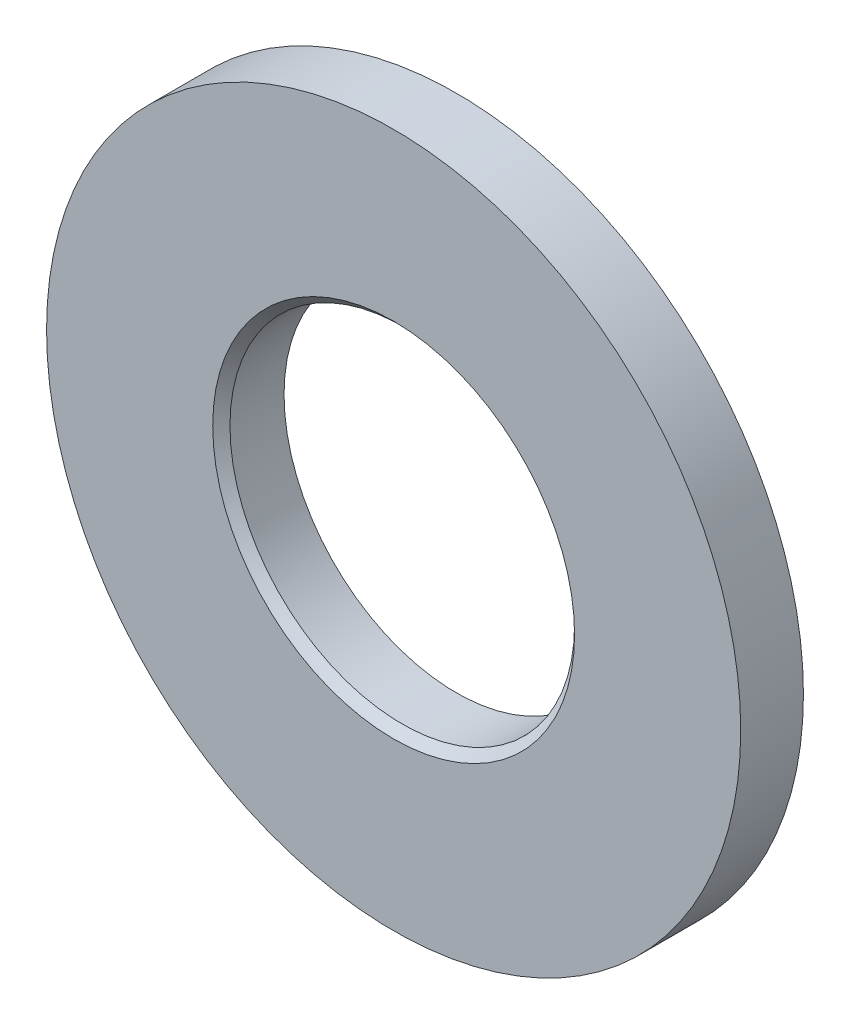
ISO-10303-21;
HEADER;
FILE_DESCRIPTION(('STEP AP214'),'2;1');
FILE_NAME('part.step','',(''),(''),'','','');
FILE_SCHEMA(('AUTOMOTIVE_DESIGN { 1 0 10303 214 1 1 1 1 }'));
ENDSEC;
DATA;
#1=APPLICATION_CONTEXT('core data for automotive mechanical design processes');
#2=APPLICATION_PROTOCOL_DEFINITION('international standard','automotive_design',2000,#1);
#3=PRODUCT_CONTEXT('',#1,'mechanical');
#4=PRODUCT('Part','Part','',(#3));
#5=PRODUCT_RELATED_PRODUCT_CATEGORY('part','',(#4));
#6=PRODUCT_DEFINITION_FORMATION('','',#4);
#7=PRODUCT_DEFINITION_CONTEXT('part definition',#1,'design');
#8=PRODUCT_DEFINITION('design','',#6,#7);
#9=PRODUCT_DEFINITION_SHAPE('','',#8);
#10=(LENGTH_UNIT() NAMED_UNIT(*) SI_UNIT(.MILLI.,.METRE.));
#11=(NAMED_UNIT(*) PLANE_ANGLE_UNIT() SI_UNIT($,.RADIAN.));
#12=(NAMED_UNIT(*) SI_UNIT($,.STERADIAN.) SOLID_ANGLE_UNIT());
#13=UNCERTAINTY_MEASURE_WITH_UNIT(LENGTH_MEASURE(1.E-05),#10,'distance_accuracy_value','');
#14=(GEOMETRIC_REPRESENTATION_CONTEXT(3) GLOBAL_UNCERTAINTY_ASSIGNED_CONTEXT((#13)) GLOBAL_UNIT_ASSIGNED_CONTEXT((#10,
#11,#12)) REPRESENTATION_CONTEXT('',''));
#15=CARTESIAN_POINT('',(0.,0.,0.));
#16=DIRECTION('',(0.,0.,1.));
#17=DIRECTION('',(1.,0.,0.));
#18=AXIS2_PLACEMENT_3D('',#15,#16,#17);
#19=CARTESIAN_POINT('',(0.,0.,0.80645));
#20=DIRECTION('',(0.,0.,1.));
#21=DIRECTION('',(1.,0.,0.));
#22=AXIS2_PLACEMENT_3D('',#19,#20,#21);
#23=PLANE('',#22);
#24=CARTESIAN_POINT('',(0.,0.,0.80645));
#25=DIRECTION('',(0.,0.,1.));
#26=DIRECTION('',(1.,0.,0.));
#27=AXIS2_PLACEMENT_3D('',#24,#25,#26);
#28=CIRCLE('',#27,4.653915);
#29=CARTESIAN_POINT('',(4.653915,0.,0.80645));
#30=VERTEX_POINT('',#29);
#31=EDGE_CURVE('E10',#30,#30,#28,.F.);
#32=ORIENTED_EDGE('',*,*,#31,.T.);
#33=EDGE_LOOP('',(#32));
#34=FACE_BOUND('',#33,.T.);
#35=CARTESIAN_POINT('',(0.,0.,0.80645));
#36=DIRECTION('',(0.,0.,1.));
#37=DIRECTION('',(1.,0.,0.));
#38=AXIS2_PLACEMENT_3D('',#35,#36,#37);
#39=CIRCLE('',#38,8.9281);
#40=CARTESIAN_POINT('',(8.9281,0.,0.80645));
#41=VERTEX_POINT('',#40);
#42=EDGE_CURVE('E52',#41,#41,#39,.T.);
#43=ORIENTED_EDGE('',*,*,#42,.T.);
#44=EDGE_LOOP('',(#43));
#45=FACE_BOUND('',#44,.T.);
#46=ADVANCED_FACE('F39',(#34,#45),#23,.T.);
#47=CARTESIAN_POINT('',(0.,0.,-0.80645));
#48=DIRECTION('',(0.,0.,1.));
#49=DIRECTION('',(1.,0.,0.));
#50=AXIS2_PLACEMENT_3D('',#47,#48,#49);
#51=PLANE('',#50);
#52=CARTESIAN_POINT('',(0.,0.,-0.80645));
#53=DIRECTION('',(0.,0.,1.));
#54=DIRECTION('',(1.,0.,0.));
#55=AXIS2_PLACEMENT_3D('',#52,#53,#54);
#56=CIRCLE('',#55,8.9281);
#57=CARTESIAN_POINT('',(8.9281,0.,-0.80645));
#58=VERTEX_POINT('',#57);
#59=EDGE_CURVE('E57',#58,#58,#56,.T.);
#60=ORIENTED_EDGE('',*,*,#59,.F.);
#61=EDGE_LOOP('',(#60));
#62=FACE_BOUND('',#61,.T.);
#63=CARTESIAN_POINT('',(0.,0.,-0.80645));
#64=DIRECTION('',(0.,0.,1.));
#65=DIRECTION('',(1.,0.,0.));
#66=AXIS2_PLACEMENT_3D('',#63,#64,#65);
#67=CIRCLE('',#66,4.4323);
#68=CARTESIAN_POINT('',(4.4323,0.,-0.80645));
#69=VERTEX_POINT('',#68);
#70=EDGE_CURVE('E62',#69,#69,#67,.T.);
#71=ORIENTED_EDGE('',*,*,#70,.T.);
#72=EDGE_LOOP('',(#71));
#73=FACE_BOUND('',#72,.T.);
#74=ADVANCED_FACE('F68',(#62,#73),#51,.F.);
#75=CARTESIAN_POINT('',(0.,0.,0.80645));
#76=DIRECTION('',(0.,0.,-1.));
#77=DIRECTION('',(-1.,0.,0.));
#78=AXIS2_PLACEMENT_3D('',#75,#76,#77);
#79=CYLINDRICAL_SURFACE('',#78,8.9281);
#80=ORIENTED_EDGE('',*,*,#42,.F.);
#81=EDGE_LOOP('',(#80));
#82=FACE_BOUND('',#81,.T.);
#83=ORIENTED_EDGE('',*,*,#59,.T.);
#84=EDGE_LOOP('',(#83));
#85=FACE_BOUND('',#84,.T.);
#86=ADVANCED_FACE('F72',(#82,#85),#79,.T.);
#87=CARTESIAN_POINT('',(0.,0.,0.80645));
#88=DIRECTION('',(0.,0.,-1.));
#89=DIRECTION('',(-1.,0.,0.));
#90=AXIS2_PLACEMENT_3D('',#87,#88,#89);
#91=CYLINDRICAL_SURFACE('',#90,4.4323);
#92=CARTESIAN_POINT('',(0.,0.,0.584834999999999));
#93=DIRECTION('',(0.,0.,1.));
#94=DIRECTION('',(1.,0.,0.));
#95=AXIS2_PLACEMENT_3D('',#92,#93,#94);
#96=CIRCLE('',#95,4.4323);
#97=CARTESIAN_POINT('',(4.4323,0.,0.584834999999999));
#98=VERTEX_POINT('',#97);
#99=EDGE_CURVE('E47',#98,#98,#96,.T.);
#100=ORIENTED_EDGE('',*,*,#99,.T.);
#101=EDGE_LOOP('',(#100));
#102=FACE_BOUND('',#101,.T.);
#103=ORIENTED_EDGE('',*,*,#70,.F.);
#104=EDGE_LOOP('',(#103));
#105=FACE_BOUND('',#104,.T.);
#106=ADVANCED_FACE('F70',(#102,#105),#91,.F.);
#107=CARTESIAN_POINT('',(0.,0.,0.584834999999999));
#108=DIRECTION('',(0.,0.,1.));
#109=DIRECTION('',(1.,0.,0.));
#110=AXIS2_PLACEMENT_3D('',#107,#108,#109);
#111=CONICAL_SURFACE('',#110,4.4323,0.785398163397444);
#112=ORIENTED_EDGE('',*,*,#31,.F.);
#113=EDGE_LOOP('',(#112));
#114=FACE_BOUND('',#113,.T.);
#115=ORIENTED_EDGE('',*,*,#99,.F.);
#116=EDGE_LOOP('',(#115));
#117=FACE_BOUND('',#116,.T.);
#118=ADVANCED_FACE('F41',(#114,#117),#111,.F.);
#119=CLOSED_SHELL('',(#46,#74,#86,#106,#118));
#120=MANIFOLD_SOLID_BREP('B2',#119);
#121=ADVANCED_BREP_SHAPE_REPRESENTATION('',(#18,#120),#14);
#122=SHAPE_DEFINITION_REPRESENTATION(#9,#121);
ENDSEC;
END-ISO-10303-21;
